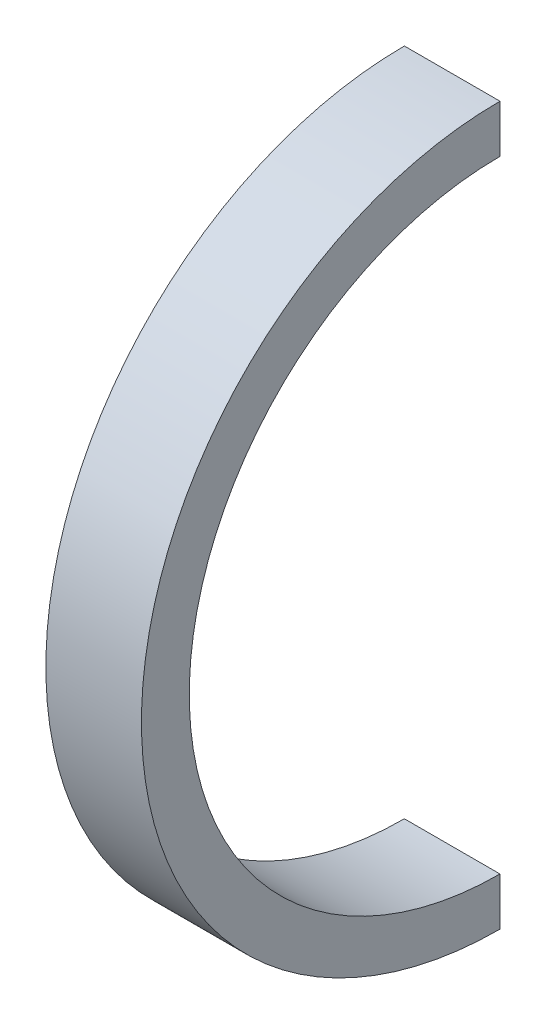
ISO-10303-21;
HEADER;
FILE_DESCRIPTION(('STEP AP214'),'2;1');
FILE_NAME('part.step','',(''),(''),'','','');
FILE_SCHEMA(('AUTOMOTIVE_DESIGN { 1 0 10303 214 1 1 1 1 }'));
ENDSEC;
DATA;
#1=APPLICATION_CONTEXT('core data for automotive mechanical design processes');
#2=APPLICATION_PROTOCOL_DEFINITION('international standard','automotive_design',2000,#1);
#3=PRODUCT_CONTEXT('',#1,'mechanical');
#4=PRODUCT('Part','Part','',(#3));
#5=PRODUCT_RELATED_PRODUCT_CATEGORY('part','',(#4));
#6=PRODUCT_DEFINITION_FORMATION('','',#4);
#7=PRODUCT_DEFINITION_CONTEXT('part definition',#1,'design');
#8=PRODUCT_DEFINITION('design','',#6,#7);
#9=PRODUCT_DEFINITION_SHAPE('','',#8);
#10=(LENGTH_UNIT() NAMED_UNIT(*) SI_UNIT(.MILLI.,.METRE.));
#11=(NAMED_UNIT(*) PLANE_ANGLE_UNIT() SI_UNIT($,.RADIAN.));
#12=(NAMED_UNIT(*) SI_UNIT($,.STERADIAN.) SOLID_ANGLE_UNIT());
#13=UNCERTAINTY_MEASURE_WITH_UNIT(LENGTH_MEASURE(1.E-05),#10,'distance_accuracy_value','');
#14=(GEOMETRIC_REPRESENTATION_CONTEXT(3) GLOBAL_UNCERTAINTY_ASSIGNED_CONTEXT((#13)) GLOBAL_UNIT_ASSIGNED_CONTEXT((#10,
#11,#12)) REPRESENTATION_CONTEXT('',''));
#15=CARTESIAN_POINT('',(0.,0.,0.));
#16=DIRECTION('',(0.,0.,1.));
#17=DIRECTION('',(1.,0.,0.));
#18=AXIS2_PLACEMENT_3D('',#15,#16,#17);
#19=CARTESIAN_POINT('',(25.4,0.,0.));
#20=DIRECTION('',(-1.,0.,0.));
#21=DIRECTION('',(0.,0.,1.));
#22=AXIS2_PLACEMENT_3D('',#19,#20,#21);
#23=CYLINDRICAL_SURFACE('',#22,95.25);
#24=DIRECTION('',(-1.,0.,0.));
#25=VECTOR('',#24,1.);
#26=CARTESIAN_POINT('',(25.4,-95.25,0.));
#27=LINE('',#26,#25);
#28=CARTESIAN_POINT('',(25.4,-95.25,0.));
#29=VERTEX_POINT('',#28);
#30=CARTESIAN_POINT('',(0.,-95.25,0.));
#31=VERTEX_POINT('',#30);
#32=EDGE_CURVE('E86',#29,#31,#27,.T.);
#33=ORIENTED_EDGE('',*,*,#32,.F.);
#34=CARTESIAN_POINT('',(25.4,0.,0.));
#35=DIRECTION('',(1.,0.,0.));
#36=DIRECTION('',(0.,0.,-1.));
#37=AXIS2_PLACEMENT_3D('',#34,#35,#36);
#38=CIRCLE('',#37,95.25);
#39=CARTESIAN_POINT('',(25.4,95.25,0.));
#40=VERTEX_POINT('',#39);
#41=EDGE_CURVE('E94',#40,#29,#38,.T.);
#42=ORIENTED_EDGE('',*,*,#41,.F.);
#43=DIRECTION('',(-1.,0.,0.));
#44=VECTOR('',#43,1.);
#45=CARTESIAN_POINT('',(25.4,95.25,0.));
#46=LINE('',#45,#44);
#47=CARTESIAN_POINT('',(0.,95.25,0.));
#48=VERTEX_POINT('',#47);
#49=EDGE_CURVE('E77',#40,#48,#46,.T.);
#50=ORIENTED_EDGE('',*,*,#49,.T.);
#51=CARTESIAN_POINT('',(0.,0.,0.));
#52=DIRECTION('',(1.,0.,0.));
#53=DIRECTION('',(0.,0.,-1.));
#54=AXIS2_PLACEMENT_3D('',#51,#52,#53);
#55=CIRCLE('',#54,95.25);
#56=EDGE_CURVE('E101',#48,#31,#55,.T.);
#57=ORIENTED_EDGE('',*,*,#56,.T.);
#58=EDGE_LOOP('',(#33,#42,#50,#57));
#59=FACE_BOUND('',#58,.T.);
#60=ADVANCED_FACE('F39',(#59),#23,.T.);
#61=CARTESIAN_POINT('',(25.4,0.,0.));
#62=DIRECTION('',(1.,0.,0.));
#63=DIRECTION('',(0.,0.,-1.));
#64=AXIS2_PLACEMENT_3D('',#61,#62,#63);
#65=PLANE('',#64);
#66=DIRECTION('',(0.,1.,0.));
#67=VECTOR('',#66,1.);
#68=CARTESIAN_POINT('',(25.4,95.25,0.));
#69=LINE('',#68,#67);
#70=CARTESIAN_POINT('',(25.4,82.55,0.));
#71=VERTEX_POINT('',#70);
#72=EDGE_CURVE('E61',#71,#40,#69,.T.);
#73=ORIENTED_EDGE('',*,*,#72,.T.);
#74=ORIENTED_EDGE('',*,*,#41,.T.);
#75=CARTESIAN_POINT('',(25.4,-82.55,0.));
#76=VERTEX_POINT('',#75);
#77=EDGE_CURVE('E87',#29,#76,#69,.T.);
#78=ORIENTED_EDGE('',*,*,#77,.T.);
#79=CARTESIAN_POINT('',(25.4,0.,0.));
#80=DIRECTION('',(1.,0.,0.));
#81=DIRECTION('',(0.,0.,-1.));
#82=AXIS2_PLACEMENT_3D('',#79,#80,#81);
#83=CIRCLE('',#82,82.55);
#84=EDGE_CURVE('E96',#71,#76,#83,.T.);
#85=ORIENTED_EDGE('',*,*,#84,.F.);
#86=EDGE_LOOP('',(#73,#74,#78,#85));
#87=FACE_BOUND('',#86,.T.);
#88=ADVANCED_FACE('F92',(#87),#65,.T.);
#89=CARTESIAN_POINT('',(0.,0.,0.));
#90=DIRECTION('',(1.,0.,0.));
#91=DIRECTION('',(0.,0.,-1.));
#92=AXIS2_PLACEMENT_3D('',#89,#90,#91);
#93=PLANE('',#92);
#94=ORIENTED_EDGE('',*,*,#56,.F.);
#95=DIRECTION('',(0.,1.,0.));
#96=VECTOR('',#95,1.);
#97=CARTESIAN_POINT('',(0.,95.25,0.));
#98=LINE('',#97,#96);
#99=CARTESIAN_POINT('',(0.,82.55,0.));
#100=VERTEX_POINT('',#99);
#101=EDGE_CURVE('E80',#100,#48,#98,.T.);
#102=ORIENTED_EDGE('',*,*,#101,.F.);
#103=CARTESIAN_POINT('',(0.,0.,0.));
#104=DIRECTION('',(1.,0.,0.));
#105=DIRECTION('',(0.,0.,-1.));
#106=AXIS2_PLACEMENT_3D('',#103,#104,#105);
#107=CIRCLE('',#106,82.55);
#108=CARTESIAN_POINT('',(0.,-82.55,0.));
#109=VERTEX_POINT('',#108);
#110=EDGE_CURVE('E107',#100,#109,#107,.T.);
#111=ORIENTED_EDGE('',*,*,#110,.T.);
#112=EDGE_CURVE('E54',#31,#109,#98,.T.);
#113=ORIENTED_EDGE('',*,*,#112,.F.);
#114=EDGE_LOOP('',(#94,#102,#111,#113));
#115=FACE_BOUND('',#114,.T.);
#116=ADVANCED_FACE('F121',(#115),#93,.F.);
#117=CARTESIAN_POINT('',(25.4,0.,0.));
#118=DIRECTION('',(-1.,0.,0.));
#119=DIRECTION('',(0.,0.,1.));
#120=AXIS2_PLACEMENT_3D('',#117,#118,#119);
#121=CYLINDRICAL_SURFACE('',#120,82.55);
#122=DIRECTION('',(-1.,0.,0.));
#123=VECTOR('',#122,1.);
#124=CARTESIAN_POINT('',(25.4,82.55,0.));
#125=LINE('',#124,#123);
#126=EDGE_CURVE('E11',#71,#100,#125,.T.);
#127=ORIENTED_EDGE('',*,*,#126,.F.);
#128=ORIENTED_EDGE('',*,*,#84,.T.);
#129=DIRECTION('',(-1.,0.,0.));
#130=VECTOR('',#129,1.);
#131=CARTESIAN_POINT('',(25.4,-82.55,0.));
#132=LINE('',#131,#130);
#133=EDGE_CURVE('E47',#109,#76,#132,.F.);
#134=ORIENTED_EDGE('',*,*,#133,.F.);
#135=ORIENTED_EDGE('',*,*,#110,.F.);
#136=EDGE_LOOP('',(#127,#128,#134,#135));
#137=FACE_BOUND('',#136,.T.);
#138=ADVANCED_FACE('F118',(#137),#121,.F.);
#139=CARTESIAN_POINT('',(25.4,95.25,0.));
#140=DIRECTION('',(0.,0.,1.));
#141=DIRECTION('',(1.,0.,0.));
#142=AXIS2_PLACEMENT_3D('',#139,#140,#141);
#143=PLANE('',#142);
#144=ORIENTED_EDGE('',*,*,#133,.T.);
#145=ORIENTED_EDGE('',*,*,#77,.F.);
#146=ORIENTED_EDGE('',*,*,#32,.T.);
#147=ORIENTED_EDGE('',*,*,#112,.T.);
#148=EDGE_LOOP('',(#144,#145,#146,#147));
#149=FACE_BOUND('',#148,.T.);
#150=ADVANCED_FACE('F128',(#149),#143,.F.);
#151=ORIENTED_EDGE('',*,*,#126,.T.);
#152=ORIENTED_EDGE('',*,*,#101,.T.);
#153=ORIENTED_EDGE('',*,*,#49,.F.);
#154=ORIENTED_EDGE('',*,*,#72,.F.);
#155=EDGE_LOOP('',(#151,#152,#153,#154));
#156=FACE_BOUND('',#155,.T.);
#157=ADVANCED_FACE('F78',(#156),#143,.F.);
#158=CLOSED_SHELL('',(#60,#88,#116,#138,#150,#157));
#159=MANIFOLD_SOLID_BREP('B2',#158);
#160=ADVANCED_BREP_SHAPE_REPRESENTATION('',(#18,#159),#14);
#161=SHAPE_DEFINITION_REPRESENTATION(#9,#160);
ENDSEC;
END-ISO-10303-21;
